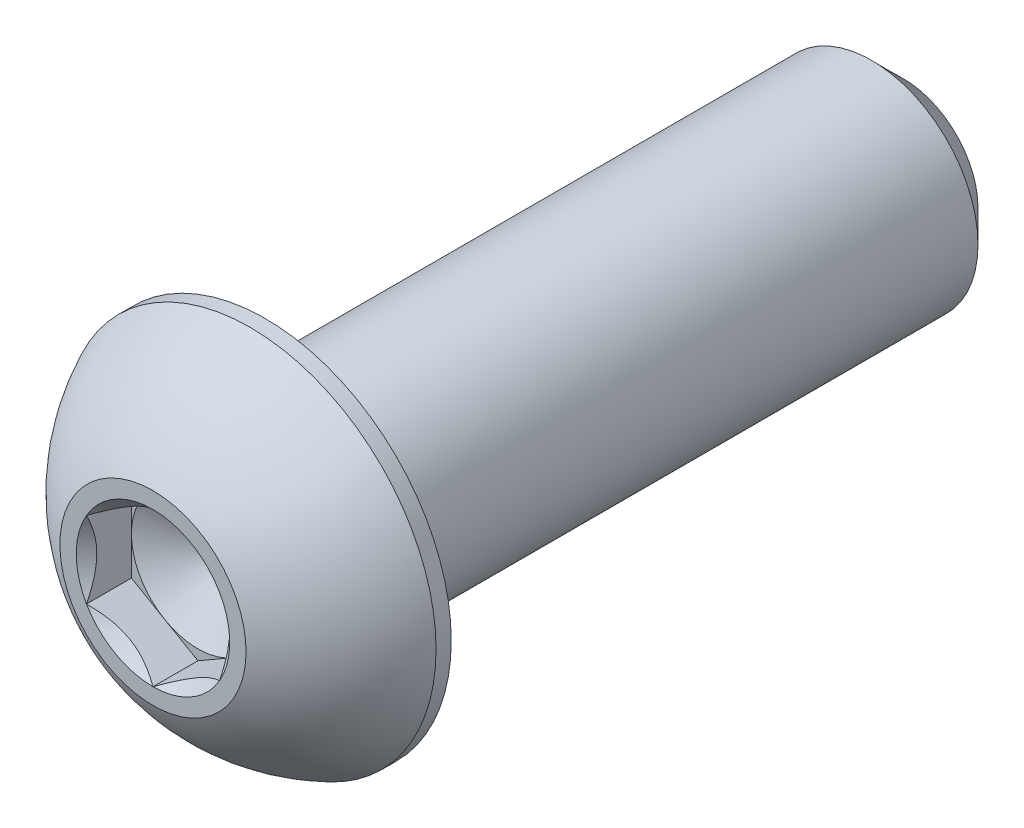
ISO-10303-21;
HEADER;
FILE_DESCRIPTION(('STEP AP214'),'2;1');
FILE_NAME('part.step','',(''),(''),'','','');
FILE_SCHEMA(('AUTOMOTIVE_DESIGN { 1 0 10303 214 1 1 1 1 }'));
ENDSEC;
DATA;
#1=APPLICATION_CONTEXT('core data for automotive mechanical design processes');
#2=APPLICATION_PROTOCOL_DEFINITION('international standard','automotive_design',2000,#1);
#3=PRODUCT_CONTEXT('',#1,'mechanical');
#4=PRODUCT('Part','Part','',(#3));
#5=PRODUCT_RELATED_PRODUCT_CATEGORY('part','',(#4));
#6=PRODUCT_DEFINITION_FORMATION('','',#4);
#7=PRODUCT_DEFINITION_CONTEXT('part definition',#1,'design');
#8=PRODUCT_DEFINITION('design','',#6,#7);
#9=PRODUCT_DEFINITION_SHAPE('','',#8);
#10=(LENGTH_UNIT() NAMED_UNIT(*) SI_UNIT(.MILLI.,.METRE.));
#11=(NAMED_UNIT(*) PLANE_ANGLE_UNIT() SI_UNIT($,.RADIAN.));
#12=(NAMED_UNIT(*) SI_UNIT($,.STERADIAN.) SOLID_ANGLE_UNIT());
#13=UNCERTAINTY_MEASURE_WITH_UNIT(LENGTH_MEASURE(1.E-05),#10,'distance_accuracy_value','');
#14=(GEOMETRIC_REPRESENTATION_CONTEXT(3) GLOBAL_UNCERTAINTY_ASSIGNED_CONTEXT((#13)) GLOBAL_UNIT_ASSIGNED_CONTEXT((#10,
#11,#12)) REPRESENTATION_CONTEXT('',''));
#15=CARTESIAN_POINT('',(0.,0.,0.));
#16=DIRECTION('',(0.,0.,1.));
#17=DIRECTION('',(1.,0.,0.));
#18=AXIS2_PLACEMENT_3D('',#15,#16,#17);
#19=CARTESIAN_POINT('',(0.,1.984375,11.2014));
#20=DIRECTION('',(0.,0.,-1.));
#21=DIRECTION('',(-1.,0.,0.));
#22=AXIS2_PLACEMENT_3D('',#19,#20,#21);
#23=PLANE('',#22);
#24=CARTESIAN_POINT('',(0.,0.,11.2014));
#25=DIRECTION('',(0.,0.,1.));
#26=DIRECTION('',(1.,0.,0.));
#27=AXIS2_PLACEMENT_3D('',#24,#25,#26);
#28=CIRCLE('',#27,2.778125);
#29=CARTESIAN_POINT('',(0.,2.778125,11.2014));
#30=VERTEX_POINT('',#29);
#31=EDGE_CURVE('E169',#30,#30,#28,.T.);
#32=ORIENTED_EDGE('',*,*,#31,.T.);
#33=EDGE_LOOP('',(#32));
#34=FACE_BOUND('',#33,.T.);
#35=CARTESIAN_POINT('',(0.,0.,11.2014));
#36=DIRECTION('',(0.,0.,1.));
#37=DIRECTION('',(1.,0.,0.));
#38=AXIS2_PLACEMENT_3D('',#35,#36,#37);
#39=CIRCLE('',#38,2.29135888084633);
#40=CARTESIAN_POINT('',(0.,2.29135888084633,11.2014));
#41=VERTEX_POINT('',#40);
#42=CARTESIAN_POINT('',(-1.984375,1.14567944042316,11.2014));
#43=VERTEX_POINT('',#42);
#44=EDGE_CURVE('E123',#41,#43,#39,.T.);
#45=ORIENTED_EDGE('',*,*,#44,.F.);
#46=CARTESIAN_POINT('',(0.,0.,11.2014));
#47=DIRECTION('',(0.,0.,1.));
#48=DIRECTION('',(1.,0.,0.));
#49=AXIS2_PLACEMENT_3D('',#46,#47,#48);
#50=CIRCLE('',#49,2.29135888084633);
#51=CARTESIAN_POINT('',(1.984375,1.14567944042316,11.2014));
#52=VERTEX_POINT('',#51);
#53=EDGE_CURVE('E108',#52,#41,#50,.T.);
#54=ORIENTED_EDGE('',*,*,#53,.F.);
#55=CARTESIAN_POINT('',(0.,0.,11.2014));
#56=DIRECTION('',(0.,0.,1.));
#57=DIRECTION('',(1.,0.,0.));
#58=AXIS2_PLACEMENT_3D('',#55,#56,#57);
#59=CIRCLE('',#58,2.29135888084633);
#60=CARTESIAN_POINT('',(1.984375,-1.14567944042316,11.2014));
#61=VERTEX_POINT('',#60);
#62=EDGE_CURVE('E119',#61,#52,#59,.T.);
#63=ORIENTED_EDGE('',*,*,#62,.F.);
#64=CARTESIAN_POINT('',(0.,0.,11.2014));
#65=DIRECTION('',(0.,0.,1.));
#66=DIRECTION('',(1.,0.,0.));
#67=AXIS2_PLACEMENT_3D('',#64,#65,#66);
#68=CIRCLE('',#67,2.29135888084633);
#69=CARTESIAN_POINT('',(0.,-2.29135888084633,11.2014));
#70=VERTEX_POINT('',#69);
#71=EDGE_CURVE('E140',#70,#61,#68,.T.);
#72=ORIENTED_EDGE('',*,*,#71,.F.);
#73=CARTESIAN_POINT('',(0.,0.,11.2014));
#74=DIRECTION('',(0.,0.,1.));
#75=DIRECTION('',(1.,0.,0.));
#76=AXIS2_PLACEMENT_3D('',#73,#74,#75);
#77=CIRCLE('',#76,2.29135888084633);
#78=CARTESIAN_POINT('',(-1.984375,-1.14567944042317,11.2014));
#79=VERTEX_POINT('',#78);
#80=EDGE_CURVE('E440',#79,#70,#77,.T.);
#81=ORIENTED_EDGE('',*,*,#80,.F.);
#82=CARTESIAN_POINT('',(0.,0.,11.2014));
#83=DIRECTION('',(0.,0.,1.));
#84=DIRECTION('',(1.,0.,0.));
#85=AXIS2_PLACEMENT_3D('',#82,#83,#84);
#86=CIRCLE('',#85,2.29135888084633);
#87=EDGE_CURVE('E449',#43,#79,#86,.T.);
#88=ORIENTED_EDGE('',*,*,#87,.F.);
#89=EDGE_LOOP('',(#45,#54,#63,#72,#81,#88));
#90=FACE_BOUND('',#89,.T.);
#91=ADVANCED_FACE('F35',(#34,#90),#23,.F.);
#92=CARTESIAN_POINT('',(0.,0.,-11.2014));
#93=DIRECTION('',(0.,0.,1.));
#94=DIRECTION('',(1.,0.,0.));
#95=AXIS2_PLACEMENT_3D('',#92,#93,#94);
#96=CONICAL_SURFACE('',#95,2.2225,0.785398163397446);
#97=CARTESIAN_POINT('',(0.,0.,-10.2489));
#98=DIRECTION('',(0.,0.,1.));
#99=DIRECTION('',(1.,0.,0.));
#100=AXIS2_PLACEMENT_3D('',#97,#98,#99);
#101=CIRCLE('',#100,3.175);
#102=CARTESIAN_POINT('',(3.175,0.,-10.2489));
#103=VERTEX_POINT('',#102);
#104=EDGE_CURVE('E11',#103,#103,#101,.T.);
#105=ORIENTED_EDGE('',*,*,#104,.F.);
#106=EDGE_LOOP('',(#105));
#107=FACE_BOUND('',#106,.T.);
#108=CARTESIAN_POINT('',(0.,0.,-11.2014));
#109=DIRECTION('',(0.,0.,1.));
#110=DIRECTION('',(1.,0.,0.));
#111=AXIS2_PLACEMENT_3D('',#108,#109,#110);
#112=CIRCLE('',#111,2.2225);
#113=CARTESIAN_POINT('',(2.2225,0.,-11.2014));
#114=VERTEX_POINT('',#113);
#115=EDGE_CURVE('E162',#114,#114,#112,.T.);
#116=ORIENTED_EDGE('',*,*,#115,.T.);
#117=EDGE_LOOP('',(#116));
#118=FACE_BOUND('',#117,.T.);
#119=ADVANCED_FACE('F37',(#107,#118),#96,.T.);
#120=CARTESIAN_POINT('',(0.,0.,11.2014));
#121=DIRECTION('',(0.,0.,1.));
#122=DIRECTION('',(1.,0.,0.));
#123=AXIS2_PLACEMENT_3D('',#120,#121,#122);
#124=CYLINDRICAL_SURFACE('',#123,3.175);
#125=CARTESIAN_POINT('',(0.,0.,7.8486));
#126=DIRECTION('',(0.,0.,1.));
#127=DIRECTION('',(1.,0.,0.));
#128=AXIS2_PLACEMENT_3D('',#125,#126,#127);
#129=CIRCLE('',#128,3.175);
#130=CARTESIAN_POINT('',(3.175,0.,7.8486));
#131=VERTEX_POINT('',#130);
#132=EDGE_CURVE('E43',#131,#131,#129,.T.);
#133=ORIENTED_EDGE('',*,*,#132,.F.);
#134=EDGE_LOOP('',(#133));
#135=FACE_BOUND('',#134,.T.);
#136=ORIENTED_EDGE('',*,*,#104,.T.);
#137=EDGE_LOOP('',(#136));
#138=FACE_BOUND('',#137,.T.);
#139=ADVANCED_FACE('F183',(#135,#138),#124,.T.);
#140=CARTESIAN_POINT('',(0.,5.5499,7.8486));
#141=DIRECTION('',(0.,0.,1.));
#142=DIRECTION('',(1.,0.,0.));
#143=AXIS2_PLACEMENT_3D('',#140,#141,#142);
#144=PLANE('',#143);
#145=CARTESIAN_POINT('',(0.,0.,7.8486));
#146=DIRECTION('',(0.,0.,1.));
#147=DIRECTION('',(1.,0.,0.));
#148=AXIS2_PLACEMENT_3D('',#145,#146,#147);
#149=CIRCLE('',#148,5.5499);
#150=CARTESIAN_POINT('',(5.5499,0.,7.8486));
#151=VERTEX_POINT('',#150);
#152=EDGE_CURVE('E176',#151,#151,#149,.T.);
#153=ORIENTED_EDGE('',*,*,#152,.F.);
#154=EDGE_LOOP('',(#153));
#155=FACE_BOUND('',#154,.T.);
#156=ORIENTED_EDGE('',*,*,#132,.T.);
#157=EDGE_LOOP('',(#156));
#158=FACE_BOUND('',#157,.T.);
#159=ADVANCED_FACE('F181',(#155,#158),#144,.F.);
#160=CARTESIAN_POINT('',(0.,0.,11.2014));
#161=DIRECTION('',(0.,0.,1.));
#162=DIRECTION('',(1.,0.,0.));
#163=AXIS2_PLACEMENT_3D('',#160,#161,#162);
#164=CYLINDRICAL_SURFACE('',#163,5.5499);
#165=CARTESIAN_POINT('',(0.,0.,8.30217142857143));
#166=DIRECTION('',(0.,0.,1.));
#167=DIRECTION('',(1.,0.,0.));
#168=AXIS2_PLACEMENT_3D('',#165,#166,#167);
#169=CIRCLE('',#168,5.5499);
#170=CARTESIAN_POINT('',(0.,5.5499,8.30217142857142));
#171=VERTEX_POINT('',#170);
#172=EDGE_CURVE('E173',#171,#171,#169,.T.);
#173=ORIENTED_EDGE('',*,*,#172,.F.);
#174=EDGE_LOOP('',(#173));
#175=FACE_BOUND('',#174,.T.);
#176=ORIENTED_EDGE('',*,*,#152,.T.);
#177=EDGE_LOOP('',(#176));
#178=FACE_BOUND('',#177,.T.);
#179=ADVANCED_FACE('F202',(#175,#178),#164,.T.);
#180=CARTESIAN_POINT('',(0.,0.,5.77082820685455));
#181=DIRECTION('',(0.,0.,1.));
#182=DIRECTION('',(0.,1.,0.));
#183=AXIS2_PLACEMENT_3D('',#180,#181,#182);
#184=SPHERICAL_SURFACE('',#183,6.09992528775001);
#185=CARTESIAN_POINT('',(0.,2.778125,11.2014));
#186=CARTESIAN_POINT('',(0.,2.81602671338564,11.1820106477222));
#187=CARTESIAN_POINT('',(0.,2.85372537445918,11.1622243821891));
#188=CARTESIAN_POINT('',(0.,2.92870021164798,11.1218669699155));
#189=CARTESIAN_POINT('',(0.,2.96597638776324,11.1012958231749));
#190=CARTESIAN_POINT('',(0.,3.04008987470139,11.0593775937889));
#191=CARTESIAN_POINT('',(0.,3.07692718552427,11.0380305111435));
#192=CARTESIAN_POINT('',(0.,3.15014680356086,10.9945697876022));
#193=CARTESIAN_POINT('',(0.,3.18652911077458,10.9724561467063));
#194=CARTESIAN_POINT('',(0.,3.25882276944387,10.9274719956597));
#195=CARTESIAN_POINT('',(0.,3.29473412089945,10.904601485509));
#196=CARTESIAN_POINT('',(0.,3.36607012592493,10.8581136233654));
#197=CARTESIAN_POINT('',(0.,3.40149477949484,10.8344962713726));
#198=CARTESIAN_POINT('',(0.,3.47184185902622,10.7865250785858));
#199=CARTESIAN_POINT('',(0.,3.50676428498768,10.7621712377917));
#200=CARTESIAN_POINT('',(0.,3.57609160000261,10.7127377437818));
#201=CARTESIAN_POINT('',(0.,3.61049648905608,10.6876580905659));
#202=CARTESIAN_POINT('',(0.,3.67877364776563,10.6367839661473));
#203=CARTESIAN_POINT('',(0.,3.71264591742172,10.6109894949444));
#204=CARTESIAN_POINT('',(0.,3.77984298835613,10.5586970423841));
#205=CARTESIAN_POINT('',(0.,3.81316778963445,10.5321990610266));
#206=CARTESIAN_POINT('',(0.,3.87925531482814,10.4785112043859));
#207=CARTESIAN_POINT('',(0.,3.91201803874352,10.4513213291027));
#208=CARTESIAN_POINT('',(0.,3.97696704663191,10.3962616041558));
#209=CARTESIAN_POINT('',(0.,4.00915333060493,10.3683917544921));
#210=CARTESIAN_POINT('',(0.,4.07293534872959,10.3119842984171));
#211=CARTESIAN_POINT('',(0.,4.10453108288122,10.2834466920057));
#212=CARTESIAN_POINT('',(0.,4.16711815037044,10.2257162328008));
#213=CARTESIAN_POINT('',(0.,4.19810948370803,10.1965233800072));
#214=CARTESIAN_POINT('',(0.,4.25947416353471,10.1374952256512));
#215=CARTESIAN_POINT('',(0.,4.28984751002382,10.1076599240888));
#216=CARTESIAN_POINT('',(0.,4.34996290103328,10.0473599514462));
#217=CARTESIAN_POINT('',(0.,4.37970494555363,10.0168952803661));
#218=CARTESIAN_POINT('',(0.,4.43854469425657,9.95534992384361));
#219=CARTESIAN_POINT('',(0.,4.46764239843916,9.92426923840117));
#220=CARTESIAN_POINT('',(0.,4.52518071056457,9.86150547835869));
#221=CARTESIAN_POINT('',(0.,4.55362131850739,9.82982240375866));
#222=CARTESIAN_POINT('',(0.,4.60983297031029,9.76586775468214));
#223=CARTESIAN_POINT('',(0.,4.63760401417036,9.73359618020565));
#224=CARTESIAN_POINT('',(0.,4.6924643634894,9.66847867864499));
#225=CARTESIAN_POINT('',(0.,4.71955366894839,9.63563275156081));
#226=CARTESIAN_POINT('',(0.,4.77303866600855,9.56938094383918));
#227=CARTESIAN_POINT('',(0.,4.79943435760973,9.53597506320173));
#228=CARTESIAN_POINT('',(0.,4.85152055556542,9.46861799290146));
#229=CARTESIAN_POINT('',(0.,4.87721106191992,9.43466680323865));
#230=CARTESIAN_POINT('',(0.,4.927875627133,9.36623399846878));
#231=CARTESIAN_POINT('',(0.,4.95284968599158,9.33175238336172));
#232=CARTESIAN_POINT('',(0.,5.00207040804362,9.26227384381449));
#233=CARTESIAN_POINT('',(0.,5.02631707123706,9.22727691937432));
#234=CARTESIAN_POINT('',(0.,5.0740723726572,9.15678310316971));
#235=CARTESIAN_POINT('',(0.,5.09758101088389,9.12128621140527));
#236=CARTESIAN_POINT('',(0.,5.1438499566405,9.0498080217543));
#237=CARTESIAN_POINT('',(0.,5.16661026417041,9.01382672386778));
#238=CARTESIAN_POINT('',(0.,5.21137257072764,8.94139549546688));
#239=CARTESIAN_POINT('',(0.,5.23337456975495,8.9049455649525));
#240=CARTESIAN_POINT('',(0.,5.276610614416,8.83159305046432));
#241=CARTESIAN_POINT('',(0.,5.29784466004975,8.79469046649051));
#242=CARTESIAN_POINT('',(0.,5.33953548787471,8.72044882181283));
#243=CARTESIAN_POINT('',(0.,5.35999227006592,8.68310976110895));
#244=CARTESIAN_POINT('',(0.,5.40011960846766,8.60801153430598));
#245=CARTESIAN_POINT('',(0.,5.41979016467818,8.57025236820689));
#246=CARTESIAN_POINT('',(0.,5.45833640797136,8.49433047394067));
#247=CARTESIAN_POINT('',(0.,5.47721209505402,8.45616774577356));
#248=CARTESIAN_POINT('',(0.,5.5141603997322,8.37945549304741));
#249=CARTESIAN_POINT('',(0.,5.53223301732771,8.34090596848837));
#250=CARTESIAN_POINT('',(0.,5.5499,8.30217142857142));
#251=B_SPLINE_CURVE_WITH_KNOTS('',3,(#185,#186,#187,#188,#189,#190,#191,#192,#193,#194,#195,
#196,#197,#198,#199,#200,#201,#202,#203,#204,#205,#206,#207,#208,#209,#210,#211,#212,#213,#214,
#215,#216,#217,#218,#219,#220,#221,#222,#223,#224,#225,#226,#227,#228,#229,#230,#231,#232,#233,
#234,#235,#236,#237,#238,#239,#240,#241,#242,#243,#244,#245,#246,#247,#248,#249,#250),
.UNSPECIFIED.,.F.,.F.,(4,2,2,2,2,2,2,2,2,2,2,2,2,2,2,2,2,2,2,2,2,2,2,2,2,2,2,2,2,2,2,2,4),(0.,
0.127717597491554,0.255435194983109,0.383152792474663,0.510870389966217,0.638587987457771,
0.766305584949326,0.894023182440879,1.02174077993243,1.14945837742399,1.27717597491554,
1.4048935724071,1.53261116989865,1.6603287673902,1.78804636488176,1.91576396237331,
2.04348155986487,2.17119915735642,2.29891675484797,2.42663435233953,2.55435194983108,
2.68206954732264,2.80978714481419,2.93750474230574,3.0652223397973,3.19293993728885,
3.32065753478041,3.44837513227196,3.57609272976351,3.70381032725507,3.83152792474662,
3.95924552223818,4.08696311972973),.UNSPECIFIED.);
#252=EDGE_CURVE('BSEAM194',#30,#171,#251,.T.);
#253=ORIENTED_EDGE('',*,*,#31,.F.);
#254=ORIENTED_EDGE('',*,*,#172,.T.);
#255=ORIENTED_EDGE('',*,*,#252,.T.);
#256=ORIENTED_EDGE('',*,*,#252,.F.);
#257=EDGE_LOOP('',(#253,#255,#254,#256));
#258=FACE_BOUND('',#257,.T.);
#259=ADVANCED_FACE('F194',(#258),#184,.T.);
#260=CARTESIAN_POINT('',(0.,2.2225,-11.2014));
#261=DIRECTION('',(0.,0.,1.));
#262=DIRECTION('',(1.,0.,0.));
#263=AXIS2_PLACEMENT_3D('',#260,#261,#262);
#264=PLANE('',#263);
#265=ORIENTED_EDGE('',*,*,#115,.F.);
#266=EDGE_LOOP('',(#265));
#267=FACE_BOUND('',#266,.T.);
#268=ADVANCED_FACE('F192',(#267),#264,.F.);
#269=CARTESIAN_POINT('',(1.984375,1.14567944042316,11.2014));
#270=DIRECTION('',(-0.499999999999999,-0.866025403784439,0.));
#271=DIRECTION('',(0.866025403784439,-0.499999999999999,0.));
#272=AXIS2_PLACEMENT_3D('',#269,#270,#271);
#273=PLANE('',#272);
#274=CARTESIAN_POINT('',(1.984575,1.14556397036933,11.2015154787818));
#275=CARTESIAN_POINT('',(1.9163590048332,1.18494849354192,11.1621628522639));
#276=CARTESIAN_POINT('',(1.84700231489303,1.22499159714897,11.1251213104462));
#277=CARTESIAN_POINT('',(1.70557619954781,1.30664400291398,11.0572988584233));
#278=CARTESIAN_POINT('',(1.63349332126322,1.34826107209555,11.0265556890918));
#279=CARTESIAN_POINT('',(1.488141602734,1.43217992591557,10.9738918888112));
#280=CARTESIAN_POINT('',(1.41490978751306,1.47446033414663,10.95183887588));
#281=CARTESIAN_POINT('',(1.26683381740529,1.55995203534886,10.9178614929439));
#282=CARTESIAN_POINT('',(1.19199418724657,1.60316071596705,10.9059117560917));
#283=CARTESIAN_POINT('',(1.06301458545618,1.6776271237807,10.8951300990819));
#284=CARTESIAN_POINT('',(1.00904128422756,1.7087886237741,10.8935338990591));
#285=CARTESIAN_POINT('',(0.901182881480198,1.77106070163465,10.8962218388653));
#286=CARTESIAN_POINT('',(0.847297817514475,1.80217125782056,10.9005080403405));
#287=CARTESIAN_POINT('',(0.740036461751394,1.86409863044402,10.9147168730135));
#288=CARTESIAN_POINT('',(0.686660807239858,1.89491507894443,10.9246458104523));
#289=CARTESIAN_POINT('',(0.580832482591102,1.95601509066828,10.9495950842745));
#290=CARTESIAN_POINT('',(0.528379742028897,1.9862986945516,10.9646150303895));
#291=CARTESIAN_POINT('',(0.39401766103635,2.06387267818152,11.0092078516357));
#292=CARTESIAN_POINT('',(0.312941642841674,2.11068193911104,11.0421429959383));
#293=CARTESIAN_POINT('',(0.19372669327016,2.17951072233758,11.0977424412022));
#294=CARTESIAN_POINT('',(0.154440075613998,2.20219286161692,11.1172775920519));
#295=CARTESIAN_POINT('',(0.0765946381319467,2.24713694590237,11.1581287381194));
#296=CARTESIAN_POINT('',(0.038035388898301,2.26939913882716,11.1794436395684));
#297=CARTESIAN_POINT('',(-0.000200000000000815,2.29147435090016,11.2015154787818));
#298=B_SPLINE_CURVE_WITH_KNOTS('',3,(#274,#275,#276,#277,#278,#279,#280,#281,#282,#283,#284,
#285,#286,#287,#288,#289,#290,#291,#292,#293,#294,#295,#296,#297),.UNSPECIFIED.,.F.,.F.,(4,2,2,
2,2,2,2,2,2,2,2,4),(0.,0.264339630306627,0.530219665093694,0.791876416371461,1.05287424418109,
1.239639843932,1.42647091743852,1.61351120244035,1.8005371524754,2.09764209964316,
2.24579179873714,2.39385111134157),.UNSPECIFIED.);
#299=EDGE_CURVE('E105',#52,#41,#298,.T.);
#300=ORIENTED_EDGE('',*,*,#299,.T.);
#301=DIRECTION('',(0.,0.,-1.));
#302=VECTOR('',#301,1.);
#303=CARTESIAN_POINT('',(0.,2.29135888084633,11.2014));
#304=LINE('',#303,#302);
#305=CARTESIAN_POINT('',(0.,2.29135888084633,9.86028));
#306=VERTEX_POINT('',#305);
#307=EDGE_CURVE('E160',#41,#306,#304,.T.);
#308=ORIENTED_EDGE('',*,*,#307,.T.);
#309=DIRECTION('',(-0.866025403784439,0.499999999999999,0.));
#310=VECTOR('',#309,1.);
#311=CARTESIAN_POINT('',(1.984375,1.14567944042316,9.86028));
#312=LINE('',#311,#310);
#313=CARTESIAN_POINT('',(0.992187499999998,1.71851916063475,9.86028));
#314=VERTEX_POINT('',#313);
#315=EDGE_CURVE('E476',#314,#306,#312,.T.);
#316=ORIENTED_EDGE('',*,*,#315,.F.);
#317=CARTESIAN_POINT('',(1.984375,1.14567944042316,9.86028));
#318=VERTEX_POINT('',#317);
#319=EDGE_CURVE('E50',#318,#314,#312,.T.);
#320=ORIENTED_EDGE('',*,*,#319,.F.);
#321=DIRECTION('',(0.,0.,-1.));
#322=VECTOR('',#321,1.);
#323=CARTESIAN_POINT('',(1.984375,1.14567944042316,11.2014));
#324=LINE('',#323,#322);
#325=EDGE_CURVE('E136',#52,#318,#324,.T.);
#326=ORIENTED_EDGE('',*,*,#325,.F.);
#327=EDGE_LOOP('',(#300,#308,#316,#320,#326));
#328=FACE_BOUND('',#327,.T.);
#329=ADVANCED_FACE('F142',(#328),#273,.T.);
#330=CARTESIAN_POINT('',(0.,2.29135888084633,11.2014));
#331=DIRECTION('',(0.5,-0.866025403784438,0.));
#332=DIRECTION('',(0.866025403784438,0.5,0.));
#333=AXIS2_PLACEMENT_3D('',#330,#331,#332);
#334=PLANE('',#333);
#335=CARTESIAN_POINT('',(0.000199999999999143,2.29147435090016,11.2015154787818));
#336=CARTESIAN_POINT('',(-0.068015995166803,2.25208982772757,11.1621628522639));
#337=CARTESIAN_POINT('',(-0.137372685106966,2.21204672412052,11.1251213104462));
#338=CARTESIAN_POINT('',(-0.278798800452188,2.13039431835551,11.0572988584233));
#339=CARTESIAN_POINT('',(-0.350881678736783,2.08877724917394,11.0265556890918));
#340=CARTESIAN_POINT('',(-0.496233397266004,2.00485839535392,10.9738918888112));
#341=CARTESIAN_POINT('',(-0.569465212486939,1.96257798712287,10.95183887588));
#342=CARTESIAN_POINT('',(-0.717541182594706,1.87708628592063,10.9178614929439));
#343=CARTESIAN_POINT('',(-0.792380812753424,1.83387760530244,10.9059117560917));
#344=CARTESIAN_POINT('',(-0.921360414543815,1.75941119748879,10.8951300990819));
#345=CARTESIAN_POINT('',(-0.975333715772442,1.72824969749539,10.8935338990591));
#346=CARTESIAN_POINT('',(-1.0831921185198,1.66597761963484,10.8962218388653));
#347=CARTESIAN_POINT('',(-1.13707718248552,1.63486706344893,10.9005080403405));
#348=CARTESIAN_POINT('',(-1.2443385382486,1.57293969082547,10.9147168730135));
#349=CARTESIAN_POINT('',(-1.29771419276014,1.54212324232506,10.9246458104523));
#350=CARTESIAN_POINT('',(-1.4035425174089,1.48102323060122,10.9495950842745));
#351=CARTESIAN_POINT('',(-1.4559952579711,1.45073962671789,10.9646150303895));
#352=CARTESIAN_POINT('',(-1.59035733896365,1.37316564308797,11.0092078516357));
#353=CARTESIAN_POINT('',(-1.67143335715832,1.32635638215845,11.0421429959383));
#354=CARTESIAN_POINT('',(-1.79064830672984,1.25752759893191,11.0977424412022));
#355=CARTESIAN_POINT('',(-1.829934924386,1.23484545965257,11.1172775920519));
#356=CARTESIAN_POINT('',(-1.90778036186805,1.18990137536712,11.1581287381194));
#357=CARTESIAN_POINT('',(-1.9463396111017,1.16763918244233,11.1794436395684));
#358=CARTESIAN_POINT('',(-1.984575,1.14556397036932,11.2015154787818));
#359=B_SPLINE_CURVE_WITH_KNOTS('',3,(#335,#336,#337,#338,#339,#340,#341,#342,#343,#344,#345,
#346,#347,#348,#349,#350,#351,#352,#353,#354,#355,#356,#357,#358),.UNSPECIFIED.,.F.,.F.,(4,2,2,
2,2,2,2,2,2,2,2,4),(0.,0.264339630306627,0.530219665093694,0.79187641637146,1.05287424418109,
1.239639843932,1.42647091743852,1.61351120244035,1.8005371524754,2.09764209964316,
2.24579179873714,2.39385111134157),.UNSPECIFIED.);
#360=EDGE_CURVE('E464',#41,#43,#359,.T.);
#361=ORIENTED_EDGE('',*,*,#360,.T.);
#362=DIRECTION('',(0.,0.,-1.));
#363=VECTOR('',#362,1.);
#364=CARTESIAN_POINT('',(-1.984375,1.14567944042316,11.2014));
#365=LINE('',#364,#363);
#366=CARTESIAN_POINT('',(-1.984375,1.14567944042316,9.86028));
#367=VERTEX_POINT('',#366);
#368=EDGE_CURVE('E157',#43,#367,#365,.T.);
#369=ORIENTED_EDGE('',*,*,#368,.T.);
#370=DIRECTION('',(-0.866025403784438,-0.5,0.));
#371=VECTOR('',#370,1.);
#372=CARTESIAN_POINT('',(0.,2.29135888084633,9.86028));
#373=LINE('',#372,#371);
#374=CARTESIAN_POINT('',(-0.9921875,1.71851916063474,9.86028));
#375=VERTEX_POINT('',#374);
#376=EDGE_CURVE('E478',#375,#367,#373,.T.);
#377=ORIENTED_EDGE('',*,*,#376,.F.);
#378=EDGE_CURVE('E479',#306,#375,#373,.T.);
#379=ORIENTED_EDGE('',*,*,#378,.F.);
#380=ORIENTED_EDGE('',*,*,#307,.F.);
#381=EDGE_LOOP('',(#361,#369,#377,#379,#380));
#382=FACE_BOUND('',#381,.T.);
#383=ADVANCED_FACE('F200',(#382),#334,.T.);
#384=CARTESIAN_POINT('',(-1.984375,1.14567944042316,11.2014));
#385=DIRECTION('',(1.,0.,0.));
#386=DIRECTION('',(0.,0.,-1.));
#387=AXIS2_PLACEMENT_3D('',#384,#385,#386);
#388=PLANE('',#387);
#389=CARTESIAN_POINT('',(-1.984375,-2.24664989492636,11.9075700833169));
#390=CARTESIAN_POINT('',(-1.984375,-2.19177035879913,11.8664466992886));
#391=CARTESIAN_POINT('',(-1.984375,-2.1365793309425,11.8257329661326));
#392=CARTESIAN_POINT('',(-1.984375,-2.0254530694156,11.7453048670618));
#393=CARTESIAN_POINT('',(-1.984375,-1.96951764844329,11.7055907602265));
#394=CARTESIAN_POINT('',(-1.984375,-1.85637247000972,11.6270599960499));
#395=CARTESIAN_POINT('',(-1.984375,-1.79915619451492,11.5882526850202));
#396=CARTESIAN_POINT('',(-1.984375,-1.68374612486123,11.5121311665578));
#397=CARTESIAN_POINT('',(-1.984375,-1.62555240093273,11.4748168524981));
#398=CARTESIAN_POINT('',(-1.984375,-1.44283684202776,11.361567942359));
#399=CARTESIAN_POINT('',(-1.984375,-1.31636516124235,11.2887214191006));
#400=CARTESIAN_POINT('',(-1.984375,-1.05716498260296,11.1557117557776));
#401=CARTESIAN_POINT('',(-1.984375,-0.924459462264122,11.0955059196547));
#402=CARTESIAN_POINT('',(-1.984375,-0.724893074141588,11.0218618396154));
#403=CARTESIAN_POINT('',(-1.984375,-0.660907572248812,11.0006629174856));
#404=CARTESIAN_POINT('',(-1.984375,-0.531425551080247,10.9634071147974));
#405=CARTESIAN_POINT('',(-1.984375,-0.465928924835295,10.9473505994633));
#406=CARTESIAN_POINT('',(-1.984375,-0.334891945890406,10.9214708434592));
#407=CARTESIAN_POINT('',(-1.984375,-0.269372555502921,10.9115431015484));
#408=CARTESIAN_POINT('',(-1.984375,-0.137675185771462,10.8981085903106));
#409=CARTESIAN_POINT('',(-1.984375,-0.0714973135780639,10.8946007929468));
#410=CARTESIAN_POINT('',(-1.984375,0.0586431546448471,10.8942516482373));
#411=CARTESIAN_POINT('',(-1.984375,0.122605247687118,10.8971896245911));
#412=CARTESIAN_POINT('',(-1.984375,0.249962419599663,10.9090917091826));
#413=CARTESIAN_POINT('',(-1.984375,0.31335744162457,10.9180564148524));
#414=CARTESIAN_POINT('',(-1.984375,0.440194078343454,10.9416811503476));
#415=CARTESIAN_POINT('',(-1.984375,0.503617615772963,10.9564367997364));
#416=CARTESIAN_POINT('',(-1.984375,0.629083701047628,10.9908707574727));
#417=CARTESIAN_POINT('',(-1.984375,0.691126376772748,11.010548607898));
#418=CARTESIAN_POINT('',(-1.984375,0.888252191671363,11.0804251863326));
#419=CARTESIAN_POINT('',(-1.984375,1.02048040542615,11.1386555893404));
#420=CARTESIAN_POINT('',(-1.984375,1.27871806100267,11.2680691802767));
#421=CARTESIAN_POINT('',(-1.984375,1.40470281207756,11.3392992719575));
#422=CARTESIAN_POINT('',(-1.984375,1.5867785992022,11.4504129319412));
#423=CARTESIAN_POINT('',(-1.984375,1.64484387516129,11.4871238248926));
#424=CARTESIAN_POINT('',(-1.984375,1.75997827817988,11.5620874476375));
#425=CARTESIAN_POINT('',(-1.984375,1.81704732901584,11.6003402946748));
#426=CARTESIAN_POINT('',(-1.984375,1.92985499213404,11.6777867819938));
#427=CARTESIAN_POINT('',(-1.984375,1.98560066211377,11.7169701932287));
#428=CARTESIAN_POINT('',(-1.984375,2.09633159947627,11.7963666099261));
#429=CARTESIAN_POINT('',(-1.984375,2.15131707145809,11.8365793297131));
#430=CARTESIAN_POINT('',(-1.984375,2.20598450458982,11.87721347261));
#431=B_SPLINE_CURVE_WITH_KNOTS('',3,(#389,#390,#391,#392,#393,#394,#395,#396,#397,#398,#399,
#400,#401,#402,#403,#404,#405,#406,#407,#408,#409,#410,#411,#412,#413,#414,#415,#416,#417,#418,
#419,#420,#421,#422,#423,#424,#425,#426,#427,#428,#429,#430),.UNSPECIFIED.,.F.,.F.,(4,2,2,2,2,2,
2,2,2,2,2,2,2,2,2,2,2,2,2,2,4),(0.,0.205736210356764,0.411525204809809,0.618909845914797,
0.826279649489809,1.26374370453551,1.69970549535382,1.90175047418286,2.10380979948048,
2.3023211047986,2.50080061937433,2.69259135253523,2.88440110079442,3.07952109080018,
3.27462293514803,3.70679897011889,4.14056631296021,4.34663769336143,4.55272477227101,
4.7571295110882,4.96147812147718),.UNSPECIFIED.);
#432=EDGE_CURVE('E457',#43,#79,#431,.F.);
#433=ORIENTED_EDGE('',*,*,#432,.T.);
#434=DIRECTION('',(0.,0.,-1.));
#435=VECTOR('',#434,1.);
#436=CARTESIAN_POINT('',(-1.984375,-1.14567944042316,11.2014));
#437=LINE('',#436,#435);
#438=CARTESIAN_POINT('',(-1.984375,-1.14567944042316,9.86028));
#439=VERTEX_POINT('',#438);
#440=EDGE_CURVE('E154',#79,#439,#437,.T.);
#441=ORIENTED_EDGE('',*,*,#440,.T.);
#442=DIRECTION('',(0.,-1.,0.));
#443=VECTOR('',#442,1.);
#444=CARTESIAN_POINT('',(-1.984375,1.14567944042316,9.86028));
#445=LINE('',#444,#443);
#446=CARTESIAN_POINT('',(-1.984375,0.,9.86028));
#447=VERTEX_POINT('',#446);
#448=EDGE_CURVE('E482',#447,#439,#445,.T.);
#449=ORIENTED_EDGE('',*,*,#448,.F.);
#450=EDGE_CURVE('E483',#367,#447,#445,.T.);
#451=ORIENTED_EDGE('',*,*,#450,.F.);
#452=ORIENTED_EDGE('',*,*,#368,.F.);
#453=EDGE_LOOP('',(#433,#441,#449,#451,#452));
#454=FACE_BOUND('',#453,.T.);
#455=ADVANCED_FACE('F321',(#454),#388,.T.);
#456=CARTESIAN_POINT('',(-1.984375,-1.14567944042316,11.2014));
#457=DIRECTION('',(0.499999999999999,0.866025403784439,0.));
#458=DIRECTION('',(-0.866025403784439,0.499999999999999,0.));
#459=AXIS2_PLACEMENT_3D('',#456,#457,#458);
#460=PLANE('',#459);
#461=CARTESIAN_POINT('',(-1.984575,-1.14556397036933,11.2015154787818));
#462=CARTESIAN_POINT('',(-1.9163590048332,-1.18494849354192,11.1621628522639));
#463=CARTESIAN_POINT('',(-1.84700231489303,-1.22499159714897,11.1251213104462));
#464=CARTESIAN_POINT('',(-1.70557619954781,-1.30664400291398,11.0572988584233));
#465=CARTESIAN_POINT('',(-1.63349332126322,-1.34826107209555,11.0265556890918));
#466=CARTESIAN_POINT('',(-1.488141602734,-1.43217992591557,10.9738918888112));
#467=CARTESIAN_POINT('',(-1.41490978751306,-1.47446033414663,10.95183887588));
#468=CARTESIAN_POINT('',(-1.26683381740529,-1.55995203534886,10.9178614929439));
#469=CARTESIAN_POINT('',(-1.19199418724657,-1.60316071596705,10.9059117560917));
#470=CARTESIAN_POINT('',(-1.06301458545618,-1.6776271237807,10.8951300990819));
#471=CARTESIAN_POINT('',(-1.00904128422756,-1.7087886237741,10.8935338990591));
#472=CARTESIAN_POINT('',(-0.901182881480199,-1.77106070163465,10.8962218388653));
#473=CARTESIAN_POINT('',(-0.847297817514476,-1.80217125782056,10.9005080403405));
#474=CARTESIAN_POINT('',(-0.740036461751395,-1.86409863044402,10.9147168730135));
#475=CARTESIAN_POINT('',(-0.686660807239859,-1.89491507894443,10.9246458104523));
#476=CARTESIAN_POINT('',(-0.580832482591103,-1.95601509066828,10.9495950842745));
#477=CARTESIAN_POINT('',(-0.528379742028897,-1.9862986945516,10.9646150303895));
#478=CARTESIAN_POINT('',(-0.39401766103635,-2.06387267818152,11.0092078516357));
#479=CARTESIAN_POINT('',(-0.312941642841674,-2.11068193911104,11.0421429959383));
#480=CARTESIAN_POINT('',(-0.193726693270158,-2.17951072233758,11.0977424412022));
#481=CARTESIAN_POINT('',(-0.154440075613996,-2.20219286161692,11.1172775920519));
#482=CARTESIAN_POINT('',(-0.076594638131944,-2.24713694590237,11.1581287381194));
#483=CARTESIAN_POINT('',(-0.0380353888982982,-2.26939913882716,11.1794436395684));
#484=CARTESIAN_POINT('',(0.000200000000002763,-2.29147435090017,11.2015154787818));
#485=B_SPLINE_CURVE_WITH_KNOTS('',3,(#461,#462,#463,#464,#465,#466,#467,#468,#469,#470,#471,
#472,#473,#474,#475,#476,#477,#478,#479,#480,#481,#482,#483,#484),.UNSPECIFIED.,.F.,.F.,(4,2,2,
2,2,2,2,2,2,2,2,4),(0.,0.264339630306627,0.530219665093695,0.791876416371461,1.05287424418109,
1.239639843932,1.42647091743852,1.61351120244035,1.8005371524754,2.09764209964317,
2.24579179873714,2.39385111134157),.UNSPECIFIED.);
#486=EDGE_CURVE('E442',#79,#70,#485,.T.);
#487=ORIENTED_EDGE('',*,*,#486,.T.);
#488=DIRECTION('',(0.,0.,-1.));
#489=VECTOR('',#488,1.);
#490=CARTESIAN_POINT('',(0.,-2.29135888084633,11.2014));
#491=LINE('',#490,#489);
#492=CARTESIAN_POINT('',(0.,-2.29135888084633,9.86028));
#493=VERTEX_POINT('',#492);
#494=EDGE_CURVE('E145',#70,#493,#491,.T.);
#495=ORIENTED_EDGE('',*,*,#494,.T.);
#496=DIRECTION('',(0.866025403784439,-0.499999999999999,0.));
#497=VECTOR('',#496,1.);
#498=CARTESIAN_POINT('',(-1.984375,-1.14567944042316,9.86028));
#499=LINE('',#498,#497);
#500=CARTESIAN_POINT('',(-0.992187499999999,-1.71851916063475,9.86028));
#501=VERTEX_POINT('',#500);
#502=EDGE_CURVE('E486',#501,#493,#499,.T.);
#503=ORIENTED_EDGE('',*,*,#502,.F.);
#504=EDGE_CURVE('E487',#439,#501,#499,.T.);
#505=ORIENTED_EDGE('',*,*,#504,.F.);
#506=ORIENTED_EDGE('',*,*,#440,.F.);
#507=EDGE_LOOP('',(#487,#495,#503,#505,#506));
#508=FACE_BOUND('',#507,.T.);
#509=ADVANCED_FACE('F331',(#508),#460,.T.);
#510=CARTESIAN_POINT('',(0.,-2.29135888084633,11.2014));
#511=DIRECTION('',(-0.5,0.866025403784438,0.));
#512=DIRECTION('',(-0.866025403784438,-0.5,0.));
#513=AXIS2_PLACEMENT_3D('',#510,#511,#512);
#514=PLANE('',#513);
#515=CARTESIAN_POINT('',(-0.00019999999999808,-2.29147435090017,11.2015154787818));
#516=CARTESIAN_POINT('',(0.068015995166804,-2.25208982772757,11.1621628522639));
#517=CARTESIAN_POINT('',(0.137372685106967,-2.21204672412052,11.1251213104462));
#518=CARTESIAN_POINT('',(0.278798800452189,-2.13039431835551,11.0572988584233));
#519=CARTESIAN_POINT('',(0.350881678736784,-2.08877724917394,11.0265556890918));
#520=CARTESIAN_POINT('',(0.496233397266005,-2.00485839535392,10.9738918888112));
#521=CARTESIAN_POINT('',(0.569465212486939,-1.96257798712287,10.95183887588));
#522=CARTESIAN_POINT('',(0.717541182594706,-1.87708628592063,10.9178614929439));
#523=CARTESIAN_POINT('',(0.792380812753425,-1.83387760530244,10.9059117560917));
#524=CARTESIAN_POINT('',(0.921360414543815,-1.75941119748879,10.8951300990819));
#525=CARTESIAN_POINT('',(0.975333715772442,-1.72824969749539,10.8935338990591));
#526=CARTESIAN_POINT('',(1.0831921185198,-1.66597761963484,10.8962218388653));
#527=CARTESIAN_POINT('',(1.13707718248552,-1.63486706344893,10.9005080403405));
#528=CARTESIAN_POINT('',(1.2443385382486,-1.57293969082547,10.9147168730135));
#529=CARTESIAN_POINT('',(1.29771419276014,-1.54212324232506,10.9246458104523));
#530=CARTESIAN_POINT('',(1.4035425174089,-1.48102323060122,10.9495950842745));
#531=CARTESIAN_POINT('',(1.4559952579711,-1.45073962671789,10.9646150303895));
#532=CARTESIAN_POINT('',(1.59035733896365,-1.37316564308797,11.0092078516357));
#533=CARTESIAN_POINT('',(1.67143335715833,-1.32635638215845,11.0421429959383));
#534=CARTESIAN_POINT('',(1.79064830672984,-1.25752759893191,11.0977424412022));
#535=CARTESIAN_POINT('',(1.829934924386,-1.23484545965257,11.1172775920519));
#536=CARTESIAN_POINT('',(1.90778036186805,-1.18990137536713,11.1581287381194));
#537=CARTESIAN_POINT('',(1.9463396111017,-1.16763918244233,11.1794436395684));
#538=CARTESIAN_POINT('',(1.984575,-1.14556397036933,11.2015154787818));
#539=B_SPLINE_CURVE_WITH_KNOTS('',3,(#515,#516,#517,#518,#519,#520,#521,#522,#523,#524,#525,
#526,#527,#528,#529,#530,#531,#532,#533,#534,#535,#536,#537,#538),.UNSPECIFIED.,.F.,.F.,(4,2,2,
2,2,2,2,2,2,2,2,4),(0.,0.264339630306627,0.530219665093694,0.791876416371459,1.05287424418109,
1.239639843932,1.42647091743852,1.61351120244034,1.8005371524754,2.09764209964316,
2.24579179873714,2.39385111134157),.UNSPECIFIED.);
#540=EDGE_CURVE('E433',#70,#61,#539,.T.);
#541=ORIENTED_EDGE('',*,*,#540,.T.);
#542=DIRECTION('',(0.,0.,-1.));
#543=VECTOR('',#542,1.);
#544=CARTESIAN_POINT('',(1.984375,-1.14567944042316,11.2014));
#545=LINE('',#544,#543);
#546=CARTESIAN_POINT('',(1.984375,-1.14567944042316,9.86028));
#547=VERTEX_POINT('',#546);
#548=EDGE_CURVE('E139',#61,#547,#545,.T.);
#549=ORIENTED_EDGE('',*,*,#548,.T.);
#550=DIRECTION('',(0.866025403784438,0.5,0.));
#551=VECTOR('',#550,1.);
#552=CARTESIAN_POINT('',(0.,-2.29135888084633,9.86028));
#553=LINE('',#552,#551);
#554=CARTESIAN_POINT('',(0.992187500000001,-1.71851916063475,9.86028));
#555=VERTEX_POINT('',#554);
#556=EDGE_CURVE('E489',#555,#547,#553,.T.);
#557=ORIENTED_EDGE('',*,*,#556,.F.);
#558=EDGE_CURVE('E490',#493,#555,#553,.T.);
#559=ORIENTED_EDGE('',*,*,#558,.F.);
#560=ORIENTED_EDGE('',*,*,#494,.F.);
#561=EDGE_LOOP('',(#541,#549,#557,#559,#560));
#562=FACE_BOUND('',#561,.T.);
#563=ADVANCED_FACE('F341',(#562),#514,.T.);
#564=CARTESIAN_POINT('',(1.984375,-1.14567944042316,11.2014));
#565=DIRECTION('',(-1.,0.,0.));
#566=DIRECTION('',(0.,-1.,0.));
#567=AXIS2_PLACEMENT_3D('',#564,#565,#566);
#568=PLANE('',#567);
#569=CARTESIAN_POINT('',(1.984375,-2.24664989492636,11.9075700833169));
#570=CARTESIAN_POINT('',(1.984375,-2.19177035879913,11.8664466992886));
#571=CARTESIAN_POINT('',(1.984375,-2.1365793309425,11.8257329661326));
#572=CARTESIAN_POINT('',(1.984375,-2.0254530694156,11.7453048670618));
#573=CARTESIAN_POINT('',(1.984375,-1.96951764844329,11.7055907602265));
#574=CARTESIAN_POINT('',(1.984375,-1.85637247000972,11.6270599960499));
#575=CARTESIAN_POINT('',(1.984375,-1.79915619451491,11.5882526850202));
#576=CARTESIAN_POINT('',(1.984375,-1.68374612486123,11.5121311665578));
#577=CARTESIAN_POINT('',(1.984375,-1.62555240093272,11.4748168524981));
#578=CARTESIAN_POINT('',(1.984375,-1.44283684202776,11.361567942359));
#579=CARTESIAN_POINT('',(1.984375,-1.31636516124235,11.2887214191006));
#580=CARTESIAN_POINT('',(1.984375,-1.05716498260296,11.1557117557776));
#581=CARTESIAN_POINT('',(1.984375,-0.924459462264121,11.0955059196547));
#582=CARTESIAN_POINT('',(1.984375,-0.724893074141587,11.0218618396154));
#583=CARTESIAN_POINT('',(1.984375,-0.660907572248812,11.0006629174856));
#584=CARTESIAN_POINT('',(1.984375,-0.531425551080246,10.9634071147974));
#585=CARTESIAN_POINT('',(1.984375,-0.465928924835294,10.9473505994633));
#586=CARTESIAN_POINT('',(1.984375,-0.334891945890404,10.9214708434593));
#587=CARTESIAN_POINT('',(1.984375,-0.26937255550292,10.9115431015484));
#588=CARTESIAN_POINT('',(1.984375,-0.13767518577146,10.8981085903106));
#589=CARTESIAN_POINT('',(1.984375,-0.0714973135780622,10.8946007929468));
#590=CARTESIAN_POINT('',(1.984375,0.0586431546448489,10.8942516482374));
#591=CARTESIAN_POINT('',(1.984375,0.122605247687119,10.8971896245911));
#592=CARTESIAN_POINT('',(1.984375,0.249962419599665,10.9090917091826));
#593=CARTESIAN_POINT('',(1.984375,0.313357441624572,10.9180564148524));
#594=CARTESIAN_POINT('',(1.984375,0.440194078343456,10.9416811503476));
#595=CARTESIAN_POINT('',(1.984375,0.503617615772965,10.9564367997364));
#596=CARTESIAN_POINT('',(1.984375,0.62908370104763,10.9908707574727));
#597=CARTESIAN_POINT('',(1.984375,0.691126376772749,11.010548607898));
#598=CARTESIAN_POINT('',(1.984375,0.888252191671364,11.0804251863326));
#599=CARTESIAN_POINT('',(1.984375,1.02048040542615,11.1386555893404));
#600=CARTESIAN_POINT('',(1.984375,1.27871806100267,11.2680691802767));
#601=CARTESIAN_POINT('',(1.984375,1.40470281207756,11.3392992719575));
#602=CARTESIAN_POINT('',(1.984375,1.5867785992022,11.4504129319412));
#603=CARTESIAN_POINT('',(1.984375,1.64484387516129,11.4871238248926));
#604=CARTESIAN_POINT('',(1.984375,1.75997827817988,11.5620874476375));
#605=CARTESIAN_POINT('',(1.984375,1.81704732901584,11.6003402946748));
#606=CARTESIAN_POINT('',(1.984375,1.92985499213404,11.6777867819938));
#607=CARTESIAN_POINT('',(1.984375,1.98560066211378,11.7169701932287));
#608=CARTESIAN_POINT('',(1.984375,2.09633159947627,11.7963666099261));
#609=CARTESIAN_POINT('',(1.984375,2.15131707145809,11.8365793297131));
#610=CARTESIAN_POINT('',(1.984375,2.20598450458983,11.87721347261));
#611=B_SPLINE_CURVE_WITH_KNOTS('',3,(#569,#570,#571,#572,#573,#574,#575,#576,#577,#578,#579,
#580,#581,#582,#583,#584,#585,#586,#587,#588,#589,#590,#591,#592,#593,#594,#595,#596,#597,#598,
#599,#600,#601,#602,#603,#604,#605,#606,#607,#608,#609,#610),.UNSPECIFIED.,.F.,.F.,(4,2,2,2,2,2,
2,2,2,2,2,2,2,2,2,2,2,2,2,2,4),(0.,0.205736210356766,0.411525204809809,0.618909845914796,
0.826279649489809,1.26374370453551,1.69970549535382,1.90175047418286,2.10380979948048,
2.3023211047986,2.50080061937433,2.69259135253523,2.88440110079442,3.07952109080018,
3.27462293514803,3.70679897011889,4.14056631296021,4.34663769336143,4.55272477227101,
4.7571295110882,4.96147812147718),.UNSPECIFIED.);
#612=EDGE_CURVE('E129',#61,#52,#611,.T.);
#613=ORIENTED_EDGE('',*,*,#612,.T.);
#614=ORIENTED_EDGE('',*,*,#325,.T.);
#615=DIRECTION('',(0.,1.,0.));
#616=VECTOR('',#615,1.);
#617=CARTESIAN_POINT('',(1.984375,-1.14567944042316,9.86028));
#618=LINE('',#617,#616);
#619=CARTESIAN_POINT('',(1.984375,0.,9.86028));
#620=VERTEX_POINT('',#619);
#621=EDGE_CURVE('E148',#620,#318,#618,.T.);
#622=ORIENTED_EDGE('',*,*,#621,.F.);
#623=EDGE_CURVE('E143',#547,#620,#618,.T.);
#624=ORIENTED_EDGE('',*,*,#623,.F.);
#625=ORIENTED_EDGE('',*,*,#548,.F.);
#626=EDGE_LOOP('',(#613,#614,#622,#624,#625));
#627=FACE_BOUND('',#626,.T.);
#628=ADVANCED_FACE('F134',(#627),#568,.T.);
#629=CARTESIAN_POINT('',(0.,0.,9.86028));
#630=DIRECTION('',(0.,0.,1.));
#631=DIRECTION('',(1.,0.,0.));
#632=AXIS2_PLACEMENT_3D('',#629,#630,#631);
#633=PLANE('',#632);
#634=CARTESIAN_POINT('',(0.,0.,9.86028));
#635=DIRECTION('',(0.,0.,1.));
#636=DIRECTION('',(1.,0.,0.));
#637=AXIS2_PLACEMENT_3D('',#634,#635,#636);
#638=CIRCLE('',#637,1.984375);
#639=EDGE_CURVE('E165',#555,#620,#638,.T.);
#640=ORIENTED_EDGE('',*,*,#639,.F.);
#641=ORIENTED_EDGE('',*,*,#556,.T.);
#642=ORIENTED_EDGE('',*,*,#623,.T.);
#643=EDGE_LOOP('',(#640,#641,#642));
#644=FACE_BOUND('',#643,.T.);
#645=ADVANCED_FACE('F243',(#644),#633,.T.);
#646=EDGE_CURVE('E502',#501,#555,#638,.T.);
#647=ORIENTED_EDGE('',*,*,#646,.F.);
#648=ORIENTED_EDGE('',*,*,#502,.T.);
#649=ORIENTED_EDGE('',*,*,#558,.T.);
#650=EDGE_LOOP('',(#647,#648,#649));
#651=FACE_BOUND('',#650,.T.);
#652=ADVANCED_FACE('F248',(#651),#633,.T.);
#653=EDGE_CURVE('E503',#447,#501,#638,.T.);
#654=ORIENTED_EDGE('',*,*,#653,.F.);
#655=ORIENTED_EDGE('',*,*,#448,.T.);
#656=ORIENTED_EDGE('',*,*,#504,.T.);
#657=EDGE_LOOP('',(#654,#655,#656));
#658=FACE_BOUND('',#657,.T.);
#659=ADVANCED_FACE('F261',(#658),#633,.T.);
#660=EDGE_CURVE('E504',#375,#447,#638,.T.);
#661=ORIENTED_EDGE('',*,*,#660,.F.);
#662=ORIENTED_EDGE('',*,*,#376,.T.);
#663=ORIENTED_EDGE('',*,*,#450,.T.);
#664=EDGE_LOOP('',(#661,#662,#663));
#665=FACE_BOUND('',#664,.T.);
#666=ADVANCED_FACE('F270',(#665),#633,.T.);
#667=EDGE_CURVE('E170',#314,#375,#638,.T.);
#668=ORIENTED_EDGE('',*,*,#667,.F.);
#669=ORIENTED_EDGE('',*,*,#315,.T.);
#670=ORIENTED_EDGE('',*,*,#378,.T.);
#671=EDGE_LOOP('',(#668,#669,#670));
#672=FACE_BOUND('',#671,.T.);
#673=ADVANCED_FACE('F279',(#672),#633,.T.);
#674=EDGE_CURVE('E166',#620,#314,#638,.T.);
#675=ORIENTED_EDGE('',*,*,#674,.F.);
#676=ORIENTED_EDGE('',*,*,#621,.T.);
#677=ORIENTED_EDGE('',*,*,#319,.T.);
#678=EDGE_LOOP('',(#675,#676,#677));
#679=FACE_BOUND('',#678,.T.);
#680=ADVANCED_FACE('F251',(#679),#633,.T.);
#681=CARTESIAN_POINT('',(0.,0.,9.86028));
#682=DIRECTION('',(0.,0.,1.));
#683=DIRECTION('',(1.,0.,0.));
#684=AXIS2_PLACEMENT_3D('',#681,#682,#683);
#685=CONICAL_SURFACE('',#684,1.984375,1.0471975511966);
#686=CARTESIAN_POINT('',(0.,0.,8.71460055957684));
#687=VERTEX_POINT('',#686);
#688=VERTEX_LOOP('',#687);
#689=FACE_BOUND('',#688,.T.);
#690=ORIENTED_EDGE('',*,*,#674,.T.);
#691=ORIENTED_EDGE('',*,*,#667,.T.);
#692=ORIENTED_EDGE('',*,*,#660,.T.);
#693=ORIENTED_EDGE('',*,*,#653,.T.);
#694=ORIENTED_EDGE('',*,*,#646,.T.);
#695=ORIENTED_EDGE('',*,*,#639,.T.);
#696=EDGE_LOOP('',(#690,#691,#692,#693,#694,#695));
#697=FACE_BOUND('',#696,.T.);
#698=ADVANCED_FACE('F211',(#689,#697),#685,.F.);
#699=CARTESIAN_POINT('',(0.,0.,11.2014));
#700=DIRECTION('',(0.,0.,1.));
#701=DIRECTION('',(1.,0.,0.));
#702=AXIS2_PLACEMENT_3D('',#699,#700,#701);
#703=CONICAL_SURFACE('',#702,2.29135888084633,0.78539816339745);
#704=ORIENTED_EDGE('',*,*,#44,.T.);
#705=ORIENTED_EDGE('',*,*,#360,.F.);
#706=EDGE_LOOP('',(#704,#705));
#707=FACE_BOUND('',#706,.T.);
#708=ADVANCED_FACE('F302',(#707),#703,.F.);
#709=CARTESIAN_POINT('',(0.,0.,11.2014));
#710=DIRECTION('',(0.,0.,1.));
#711=DIRECTION('',(1.,0.,0.));
#712=AXIS2_PLACEMENT_3D('',#709,#710,#711);
#713=CONICAL_SURFACE('',#712,2.29135888084633,0.78539816339745);
#714=ORIENTED_EDGE('',*,*,#87,.T.);
#715=ORIENTED_EDGE('',*,*,#432,.F.);
#716=EDGE_LOOP('',(#714,#715));
#717=FACE_BOUND('',#716,.T.);
#718=ADVANCED_FACE('F364',(#717),#713,.F.);
#719=CARTESIAN_POINT('',(0.,0.,11.2014));
#720=DIRECTION('',(0.,0.,1.));
#721=DIRECTION('',(1.,0.,0.));
#722=AXIS2_PLACEMENT_3D('',#719,#720,#721);
#723=CONICAL_SURFACE('',#722,2.29135888084633,0.78539816339745);
#724=ORIENTED_EDGE('',*,*,#80,.T.);
#725=ORIENTED_EDGE('',*,*,#486,.F.);
#726=EDGE_LOOP('',(#724,#725));
#727=FACE_BOUND('',#726,.T.);
#728=ADVANCED_FACE('F374',(#727),#723,.F.);
#729=CARTESIAN_POINT('',(0.,0.,11.2014));
#730=DIRECTION('',(0.,0.,1.));
#731=DIRECTION('',(1.,0.,0.));
#732=AXIS2_PLACEMENT_3D('',#729,#730,#731);
#733=CONICAL_SURFACE('',#732,2.29135888084633,0.78539816339745);
#734=ORIENTED_EDGE('',*,*,#71,.T.);
#735=ORIENTED_EDGE('',*,*,#540,.F.);
#736=EDGE_LOOP('',(#734,#735));
#737=FACE_BOUND('',#736,.T.);
#738=ADVANCED_FACE('F384',(#737),#733,.F.);
#739=CARTESIAN_POINT('',(0.,0.,11.2014));
#740=DIRECTION('',(0.,0.,1.));
#741=DIRECTION('',(1.,0.,0.));
#742=AXIS2_PLACEMENT_3D('',#739,#740,#741);
#743=CONICAL_SURFACE('',#742,2.29135888084633,0.78539816339745);
#744=ORIENTED_EDGE('',*,*,#62,.T.);
#745=ORIENTED_EDGE('',*,*,#612,.F.);
#746=EDGE_LOOP('',(#744,#745));
#747=FACE_BOUND('',#746,.T.);
#748=ADVANCED_FACE('F128',(#747),#743,.F.);
#749=CARTESIAN_POINT('',(0.,0.,11.2014));
#750=DIRECTION('',(0.,0.,1.));
#751=DIRECTION('',(1.,0.,0.));
#752=AXIS2_PLACEMENT_3D('',#749,#750,#751);
#753=CONICAL_SURFACE('',#752,2.29135888084633,0.78539816339745);
#754=ORIENTED_EDGE('',*,*,#53,.T.);
#755=ORIENTED_EDGE('',*,*,#299,.F.);
#756=EDGE_LOOP('',(#754,#755));
#757=FACE_BOUND('',#756,.T.);
#758=ADVANCED_FACE('F107',(#757),#753,.F.);
#759=CLOSED_SHELL('',(#91,#119,#139,#159,#179,#259,#268,#329,#383,#455,#509,#563,#628,#645,#652,
#659,#666,#673,#680,#698,#708,#718,#728,#738,#748,#758));
#760=MANIFOLD_SOLID_BREP('B2',#759);
#761=ADVANCED_BREP_SHAPE_REPRESENTATION('',(#18,#760),#14);
#762=SHAPE_DEFINITION_REPRESENTATION(#9,#761);
ENDSEC;
END-ISO-10303-21;
